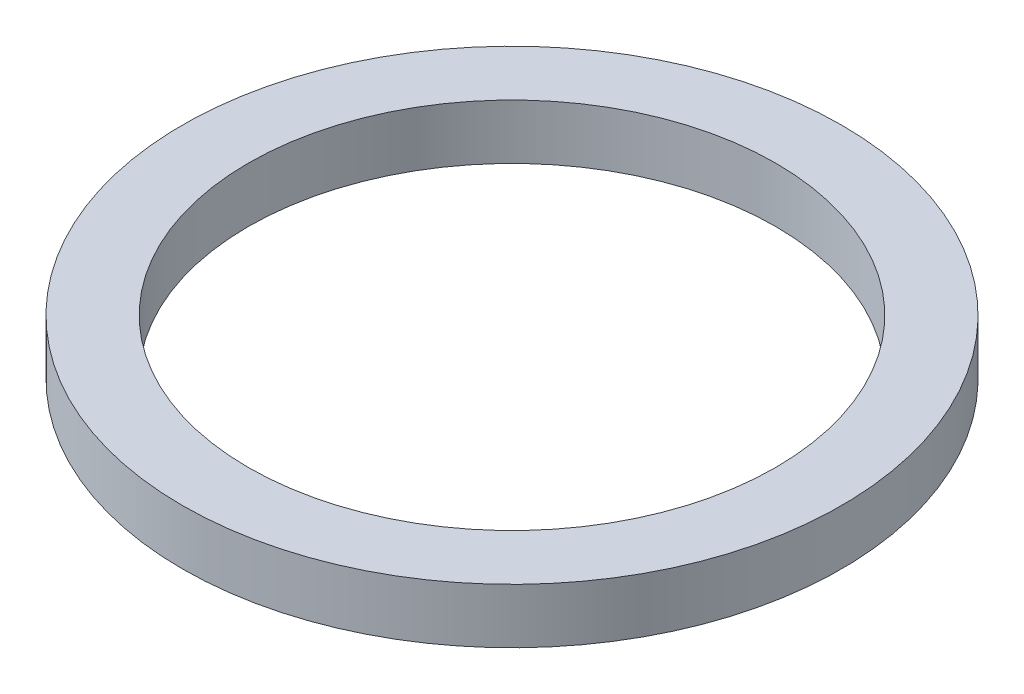
ISO-10303-21;
HEADER;
FILE_DESCRIPTION(('STEP AP214'),'2;1');
FILE_NAME('part.step','',(''),(''),'','','');
FILE_SCHEMA(('AUTOMOTIVE_DESIGN { 1 0 10303 214 1 1 1 1 }'));
ENDSEC;
DATA;
#1=APPLICATION_CONTEXT('core data for automotive mechanical design processes');
#2=APPLICATION_PROTOCOL_DEFINITION('international standard','automotive_design',2000,#1);
#3=PRODUCT_CONTEXT('',#1,'mechanical');
#4=PRODUCT('Part','Part','',(#3));
#5=PRODUCT_RELATED_PRODUCT_CATEGORY('part','',(#4));
#6=PRODUCT_DEFINITION_FORMATION('','',#4);
#7=PRODUCT_DEFINITION_CONTEXT('part definition',#1,'design');
#8=PRODUCT_DEFINITION('design','',#6,#7);
#9=PRODUCT_DEFINITION_SHAPE('','',#8);
#10=(LENGTH_UNIT() NAMED_UNIT(*) SI_UNIT(.MILLI.,.METRE.));
#11=(NAMED_UNIT(*) PLANE_ANGLE_UNIT() SI_UNIT($,.RADIAN.));
#12=(NAMED_UNIT(*) SI_UNIT($,.STERADIAN.) SOLID_ANGLE_UNIT());
#13=UNCERTAINTY_MEASURE_WITH_UNIT(LENGTH_MEASURE(1.E-05),#10,'distance_accuracy_value','');
#14=(GEOMETRIC_REPRESENTATION_CONTEXT(3) GLOBAL_UNCERTAINTY_ASSIGNED_CONTEXT((#13)) GLOBAL_UNIT_ASSIGNED_CONTEXT((#10,
#11,#12)) REPRESENTATION_CONTEXT('',''));
#15=CARTESIAN_POINT('',(0.,0.,0.));
#16=DIRECTION('',(0.,0.,1.));
#17=DIRECTION('',(1.,0.,0.));
#18=AXIS2_PLACEMENT_3D('',#15,#16,#17);
#19=CARTESIAN_POINT('',(0.,5.,0.));
#20=DIRECTION('',(0.,1.,0.));
#21=DIRECTION('',(0.,0.,1.));
#22=AXIS2_PLACEMENT_3D('',#19,#20,#21);
#23=PLANE('',#22);
#24=CARTESIAN_POINT('',(0.,5.,0.));
#25=DIRECTION('',(0.,1.,0.));
#26=DIRECTION('',(0.,0.,1.));
#27=AXIS2_PLACEMENT_3D('',#24,#25,#26);
#28=CIRCLE('',#27,30.);
#29=CARTESIAN_POINT('',(0.,5.,30.));
#30=VERTEX_POINT('',#29);
#31=EDGE_CURVE('E10',#30,#30,#28,.T.);
#32=ORIENTED_EDGE('',*,*,#31,.T.);
#33=EDGE_LOOP('',(#32));
#34=FACE_BOUND('',#33,.T.);
#35=CARTESIAN_POINT('',(0.,5.,0.));
#36=DIRECTION('',(0.,1.,0.));
#37=DIRECTION('',(0.,0.,1.));
#38=AXIS2_PLACEMENT_3D('',#35,#36,#37);
#39=CIRCLE('',#38,24.);
#40=CARTESIAN_POINT('',(0.,5.,24.));
#41=VERTEX_POINT('',#40);
#42=EDGE_CURVE('E42',#41,#41,#39,.T.);
#43=ORIENTED_EDGE('',*,*,#42,.F.);
#44=EDGE_LOOP('',(#43));
#45=FACE_BOUND('',#44,.T.);
#46=ADVANCED_FACE('F31',(#34,#45),#23,.T.);
#47=CARTESIAN_POINT('',(0.,0.,0.));
#48=DIRECTION('',(0.,1.,0.));
#49=DIRECTION('',(0.,0.,1.));
#50=AXIS2_PLACEMENT_3D('',#47,#48,#49);
#51=PLANE('',#50);
#52=CARTESIAN_POINT('',(0.,0.,0.));
#53=DIRECTION('',(0.,1.,0.));
#54=DIRECTION('',(0.,0.,1.));
#55=AXIS2_PLACEMENT_3D('',#52,#53,#54);
#56=CIRCLE('',#55,30.);
#57=CARTESIAN_POINT('',(0.,0.,30.));
#58=VERTEX_POINT('',#57);
#59=EDGE_CURVE('E35',#58,#58,#56,.T.);
#60=ORIENTED_EDGE('',*,*,#59,.F.);
#61=EDGE_LOOP('',(#60));
#62=FACE_BOUND('',#61,.T.);
#63=CARTESIAN_POINT('',(0.,0.,0.));
#64=DIRECTION('',(0.,1.,0.));
#65=DIRECTION('',(0.,0.,1.));
#66=AXIS2_PLACEMENT_3D('',#63,#64,#65);
#67=CIRCLE('',#66,24.);
#68=CARTESIAN_POINT('',(0.,0.,24.));
#69=VERTEX_POINT('',#68);
#70=EDGE_CURVE('E44',#69,#69,#67,.T.);
#71=ORIENTED_EDGE('',*,*,#70,.T.);
#72=EDGE_LOOP('',(#71));
#73=FACE_BOUND('',#72,.T.);
#74=ADVANCED_FACE('F54',(#62,#73),#51,.F.);
#75=CARTESIAN_POINT('',(0.,5.,0.));
#76=DIRECTION('',(0.,-1.,0.));
#77=DIRECTION('',(0.,0.,-1.));
#78=AXIS2_PLACEMENT_3D('',#75,#76,#77);
#79=CYLINDRICAL_SURFACE('',#78,30.);
#80=ORIENTED_EDGE('',*,*,#31,.F.);
#81=EDGE_LOOP('',(#80));
#82=FACE_BOUND('',#81,.T.);
#83=ORIENTED_EDGE('',*,*,#59,.T.);
#84=EDGE_LOOP('',(#83));
#85=FACE_BOUND('',#84,.T.);
#86=ADVANCED_FACE('F33',(#82,#85),#79,.T.);
#87=CARTESIAN_POINT('',(0.,5.,0.));
#88=DIRECTION('',(0.,-1.,0.));
#89=DIRECTION('',(0.,0.,-1.));
#90=AXIS2_PLACEMENT_3D('',#87,#88,#89);
#91=CYLINDRICAL_SURFACE('',#90,24.);
#92=ORIENTED_EDGE('',*,*,#42,.T.);
#93=EDGE_LOOP('',(#92));
#94=FACE_BOUND('',#93,.T.);
#95=ORIENTED_EDGE('',*,*,#70,.F.);
#96=EDGE_LOOP('',(#95));
#97=FACE_BOUND('',#96,.T.);
#98=ADVANCED_FACE('F50',(#94,#97),#91,.F.);
#99=CLOSED_SHELL('',(#46,#74,#86,#98));
#100=MANIFOLD_SOLID_BREP('B2',#99);
#101=ADVANCED_BREP_SHAPE_REPRESENTATION('',(#18,#100),#14);
#102=SHAPE_DEFINITION_REPRESENTATION(#9,#101);
ENDSEC;
END-ISO-10303-21;
